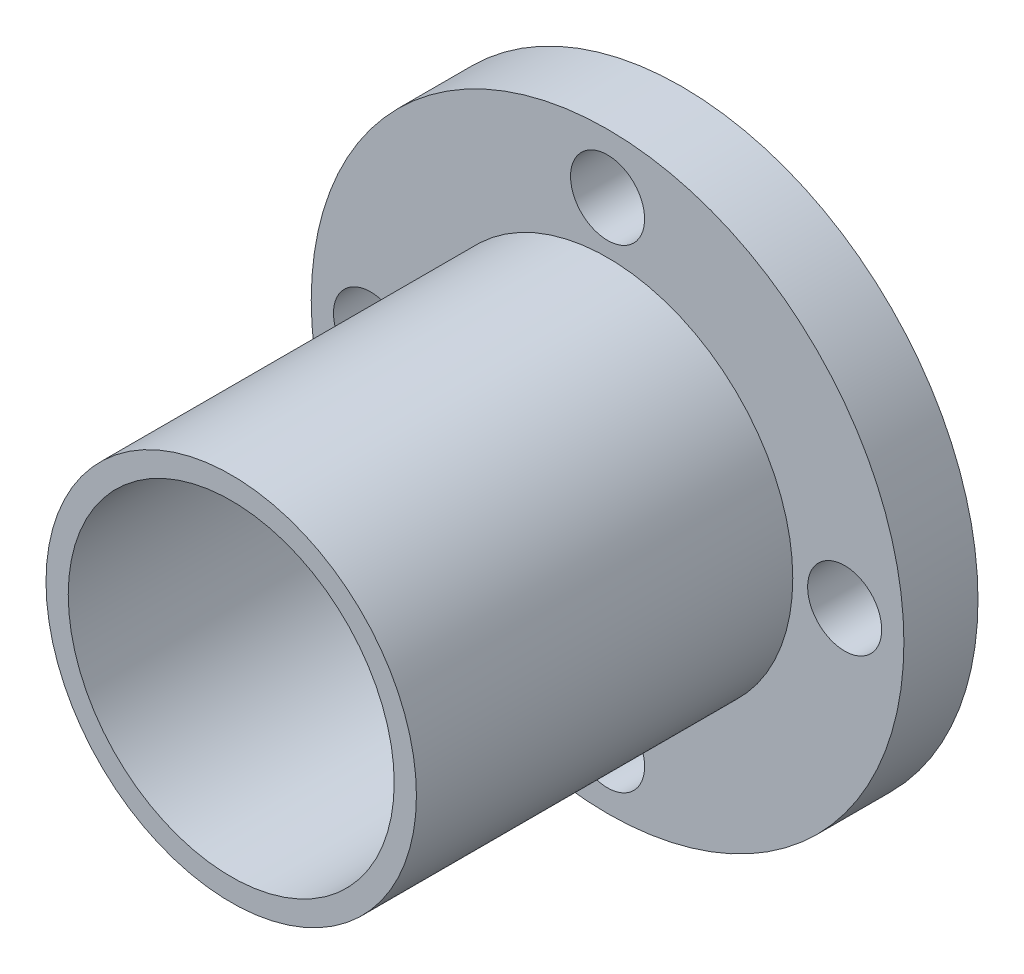
ISO-10303-21;
HEADER;
FILE_DESCRIPTION(('STEP AP214'),'2;1');
FILE_NAME('part.step','',(''),(''),'','','');
FILE_SCHEMA(('AUTOMOTIVE_DESIGN { 1 0 10303 214 1 1 1 1 }'));
ENDSEC;
DATA;
#1=APPLICATION_CONTEXT('core data for automotive mechanical design processes');
#2=APPLICATION_PROTOCOL_DEFINITION('international standard','automotive_design',2000,#1);
#3=PRODUCT_CONTEXT('',#1,'mechanical');
#4=PRODUCT('Part','Part','',(#3));
#5=PRODUCT_RELATED_PRODUCT_CATEGORY('part','',(#4));
#6=PRODUCT_DEFINITION_FORMATION('','',#4);
#7=PRODUCT_DEFINITION_CONTEXT('part definition',#1,'design');
#8=PRODUCT_DEFINITION('design','',#6,#7);
#9=PRODUCT_DEFINITION_SHAPE('','',#8);
#10=(LENGTH_UNIT() NAMED_UNIT(*) SI_UNIT(.MILLI.,.METRE.));
#11=(NAMED_UNIT(*) PLANE_ANGLE_UNIT() SI_UNIT($,.RADIAN.));
#12=(NAMED_UNIT(*) SI_UNIT($,.STERADIAN.) SOLID_ANGLE_UNIT());
#13=UNCERTAINTY_MEASURE_WITH_UNIT(LENGTH_MEASURE(1.E-05),#10,'distance_accuracy_value','');
#14=(GEOMETRIC_REPRESENTATION_CONTEXT(3) GLOBAL_UNCERTAINTY_ASSIGNED_CONTEXT((#13)) GLOBAL_UNIT_ASSIGNED_CONTEXT((#10,
#11,#12)) REPRESENTATION_CONTEXT('',''));
#15=CARTESIAN_POINT('',(0.,0.,0.));
#16=DIRECTION('',(0.,0.,1.));
#17=DIRECTION('',(1.,0.,0.));
#18=AXIS2_PLACEMENT_3D('',#15,#16,#17);
#19=CARTESIAN_POINT('',(0.,0.,10.));
#20=DIRECTION('',(0.,0.,1.));
#21=DIRECTION('',(1.,0.,0.));
#22=AXIS2_PLACEMENT_3D('',#19,#20,#21);
#23=PLANE('',#22);
#24=CARTESIAN_POINT('',(0.,0.,10.));
#25=DIRECTION('',(0.,0.,1.));
#26=DIRECTION('',(1.,0.,0.));
#27=AXIS2_PLACEMENT_3D('',#24,#25,#26);
#28=CIRCLE('',#27,25.);
#29=CARTESIAN_POINT('',(25.,0.,10.));
#30=VERTEX_POINT('',#29);
#31=EDGE_CURVE('E96',#30,#30,#28,.T.);
#32=ORIENTED_EDGE('',*,*,#31,.F.);
#33=EDGE_LOOP('',(#32));
#34=FACE_BOUND('',#33,.T.);
#35=CARTESIAN_POINT('',(-32.,0.,10.));
#36=DIRECTION('',(0.,0.,1.));
#37=DIRECTION('',(1.,0.,0.));
#38=AXIS2_PLACEMENT_3D('',#35,#36,#37);
#39=CIRCLE('',#38,5.);
#40=CARTESIAN_POINT('',(-27.,0.,10.));
#41=VERTEX_POINT('',#40);
#42=EDGE_CURVE('E76',#41,#41,#39,.T.);
#43=ORIENTED_EDGE('',*,*,#42,.F.);
#44=EDGE_LOOP('',(#43));
#45=FACE_BOUND('',#44,.T.);
#46=CARTESIAN_POINT('',(0.,-32.,10.));
#47=DIRECTION('',(0.,0.,1.));
#48=DIRECTION('',(1.,0.,0.));
#49=AXIS2_PLACEMENT_3D('',#46,#47,#48);
#50=CIRCLE('',#49,5.);
#51=CARTESIAN_POINT('',(5.,-32.,10.));
#52=VERTEX_POINT('',#51);
#53=EDGE_CURVE('E62',#52,#52,#50,.T.);
#54=ORIENTED_EDGE('',*,*,#53,.F.);
#55=EDGE_LOOP('',(#54));
#56=FACE_BOUND('',#55,.T.);
#57=CARTESIAN_POINT('',(0.,0.,10.));
#58=DIRECTION('',(0.,0.,1.));
#59=DIRECTION('',(1.,0.,0.));
#60=AXIS2_PLACEMENT_3D('',#57,#58,#59);
#61=CIRCLE('',#60,40.);
#62=CARTESIAN_POINT('',(40.,0.,10.));
#63=VERTEX_POINT('',#62);
#64=EDGE_CURVE('E52',#63,#63,#61,.T.);
#65=ORIENTED_EDGE('',*,*,#64,.T.);
#66=EDGE_LOOP('',(#65));
#67=FACE_BOUND('',#66,.T.);
#68=CARTESIAN_POINT('',(0.,32.,10.));
#69=DIRECTION('',(0.,0.,1.));
#70=DIRECTION('',(-1.,0.,0.));
#71=AXIS2_PLACEMENT_3D('',#68,#69,#70);
#72=CIRCLE('',#71,5.);
#73=CARTESIAN_POINT('',(-5.,32.,10.));
#74=VERTEX_POINT('',#73);
#75=EDGE_CURVE('E68',#74,#74,#72,.T.);
#76=ORIENTED_EDGE('',*,*,#75,.F.);
#77=EDGE_LOOP('',(#76));
#78=FACE_BOUND('',#77,.T.);
#79=CARTESIAN_POINT('',(32.,0.,10.));
#80=DIRECTION('',(0.,0.,1.));
#81=DIRECTION('',(-1.,0.,0.));
#82=AXIS2_PLACEMENT_3D('',#79,#80,#81);
#83=CIRCLE('',#82,5.);
#84=CARTESIAN_POINT('',(27.,0.,10.));
#85=VERTEX_POINT('',#84);
#86=EDGE_CURVE('E84',#85,#85,#83,.T.);
#87=ORIENTED_EDGE('',*,*,#86,.F.);
#88=EDGE_LOOP('',(#87));
#89=FACE_BOUND('',#88,.T.);
#90=ADVANCED_FACE('F43',(#34,#45,#56,#67,#78,#89),#23,.T.);
#91=CARTESIAN_POINT('',(0.,0.,0.));
#92=DIRECTION('',(0.,0.,1.));
#93=DIRECTION('',(1.,0.,0.));
#94=AXIS2_PLACEMENT_3D('',#91,#92,#93);
#95=PLANE('',#94);
#96=CARTESIAN_POINT('',(0.,0.,0.));
#97=DIRECTION('',(0.,0.,-1.));
#98=DIRECTION('',(-1.,0.,0.));
#99=AXIS2_PLACEMENT_3D('',#96,#97,#98);
#100=CIRCLE('',#99,10.);
#101=CARTESIAN_POINT('',(-10.,0.,0.));
#102=VERTEX_POINT('',#101);
#103=EDGE_CURVE('E107',#102,#102,#100,.T.);
#104=ORIENTED_EDGE('',*,*,#103,.F.);
#105=EDGE_LOOP('',(#104));
#106=FACE_BOUND('',#105,.T.);
#107=CARTESIAN_POINT('',(0.,0.,0.));
#108=DIRECTION('',(0.,0.,1.));
#109=DIRECTION('',(1.,0.,0.));
#110=AXIS2_PLACEMENT_3D('',#107,#108,#109);
#111=CIRCLE('',#110,40.);
#112=CARTESIAN_POINT('',(40.,0.,0.));
#113=VERTEX_POINT('',#112);
#114=EDGE_CURVE('E57',#113,#113,#111,.T.);
#115=ORIENTED_EDGE('',*,*,#114,.F.);
#116=EDGE_LOOP('',(#115));
#117=FACE_BOUND('',#116,.T.);
#118=CARTESIAN_POINT('',(0.,-32.,0.));
#119=DIRECTION('',(0.,0.,1.));
#120=DIRECTION('',(1.,0.,0.));
#121=AXIS2_PLACEMENT_3D('',#118,#119,#120);
#122=CIRCLE('',#121,5.);
#123=CARTESIAN_POINT('',(5.,-32.,0.));
#124=VERTEX_POINT('',#123);
#125=EDGE_CURVE('E64',#124,#124,#122,.T.);
#126=ORIENTED_EDGE('',*,*,#125,.T.);
#127=EDGE_LOOP('',(#126));
#128=FACE_BOUND('',#127,.T.);
#129=CARTESIAN_POINT('',(0.,32.,0.));
#130=DIRECTION('',(0.,0.,1.));
#131=DIRECTION('',(-1.,0.,0.));
#132=AXIS2_PLACEMENT_3D('',#129,#130,#131);
#133=CIRCLE('',#132,5.);
#134=CARTESIAN_POINT('',(-5.,32.,0.));
#135=VERTEX_POINT('',#134);
#136=EDGE_CURVE('E72',#135,#135,#133,.T.);
#137=ORIENTED_EDGE('',*,*,#136,.T.);
#138=EDGE_LOOP('',(#137));
#139=FACE_BOUND('',#138,.T.);
#140=CARTESIAN_POINT('',(-32.,0.,0.));
#141=DIRECTION('',(0.,0.,1.));
#142=DIRECTION('',(1.,0.,0.));
#143=AXIS2_PLACEMENT_3D('',#140,#141,#142);
#144=CIRCLE('',#143,5.);
#145=CARTESIAN_POINT('',(-27.,0.,0.));
#146=VERTEX_POINT('',#145);
#147=EDGE_CURVE('E80',#146,#146,#144,.T.);
#148=ORIENTED_EDGE('',*,*,#147,.T.);
#149=EDGE_LOOP('',(#148));
#150=FACE_BOUND('',#149,.T.);
#151=CARTESIAN_POINT('',(32.,0.,0.));
#152=DIRECTION('',(0.,0.,1.));
#153=DIRECTION('',(-1.,0.,0.));
#154=AXIS2_PLACEMENT_3D('',#151,#152,#153);
#155=CIRCLE('',#154,5.);
#156=CARTESIAN_POINT('',(27.,0.,0.));
#157=VERTEX_POINT('',#156);
#158=EDGE_CURVE('E88',#157,#157,#155,.T.);
#159=ORIENTED_EDGE('',*,*,#158,.T.);
#160=EDGE_LOOP('',(#159));
#161=FACE_BOUND('',#160,.T.);
#162=ADVANCED_FACE('F134',(#106,#117,#128,#139,#150,#161),#95,.F.);
#163=CARTESIAN_POINT('',(0.,0.,10.));
#164=DIRECTION('',(0.,0.,-1.));
#165=DIRECTION('',(-1.,0.,0.));
#166=AXIS2_PLACEMENT_3D('',#163,#164,#165);
#167=CYLINDRICAL_SURFACE('',#166,40.);
#168=ORIENTED_EDGE('',*,*,#64,.F.);
#169=EDGE_LOOP('',(#168));
#170=FACE_BOUND('',#169,.T.);
#171=ORIENTED_EDGE('',*,*,#114,.T.);
#172=EDGE_LOOP('',(#171));
#173=FACE_BOUND('',#172,.T.);
#174=ADVANCED_FACE('F45',(#170,#173),#167,.T.);
#175=CARTESIAN_POINT('',(0.,-32.,10.));
#176=DIRECTION('',(0.,0.,-1.));
#177=DIRECTION('',(-1.,0.,0.));
#178=AXIS2_PLACEMENT_3D('',#175,#176,#177);
#179=CYLINDRICAL_SURFACE('',#178,5.);
#180=ORIENTED_EDGE('',*,*,#53,.T.);
#181=EDGE_LOOP('',(#180));
#182=FACE_BOUND('',#181,.T.);
#183=ORIENTED_EDGE('',*,*,#125,.F.);
#184=EDGE_LOOP('',(#183));
#185=FACE_BOUND('',#184,.T.);
#186=ADVANCED_FACE('F171',(#182,#185),#179,.F.);
#187=CARTESIAN_POINT('',(0.,32.,10.));
#188=DIRECTION('',(0.,0.,-1.));
#189=DIRECTION('',(-1.,0.,0.));
#190=AXIS2_PLACEMENT_3D('',#187,#188,#189);
#191=CYLINDRICAL_SURFACE('',#190,5.);
#192=ORIENTED_EDGE('',*,*,#75,.T.);
#193=EDGE_LOOP('',(#192));
#194=FACE_BOUND('',#193,.T.);
#195=ORIENTED_EDGE('',*,*,#136,.F.);
#196=EDGE_LOOP('',(#195));
#197=FACE_BOUND('',#196,.T.);
#198=ADVANCED_FACE('F165',(#194,#197),#191,.F.);
#199=CARTESIAN_POINT('',(-32.,0.,10.));
#200=DIRECTION('',(0.,0.,-1.));
#201=DIRECTION('',(-1.,0.,0.));
#202=AXIS2_PLACEMENT_3D('',#199,#200,#201);
#203=CYLINDRICAL_SURFACE('',#202,5.);
#204=ORIENTED_EDGE('',*,*,#42,.T.);
#205=EDGE_LOOP('',(#204));
#206=FACE_BOUND('',#205,.T.);
#207=ORIENTED_EDGE('',*,*,#147,.F.);
#208=EDGE_LOOP('',(#207));
#209=FACE_BOUND('',#208,.T.);
#210=ADVANCED_FACE('F156',(#206,#209),#203,.F.);
#211=CARTESIAN_POINT('',(32.,0.,10.));
#212=DIRECTION('',(0.,0.,-1.));
#213=DIRECTION('',(-1.,0.,0.));
#214=AXIS2_PLACEMENT_3D('',#211,#212,#213);
#215=CYLINDRICAL_SURFACE('',#214,5.);
#216=ORIENTED_EDGE('',*,*,#86,.T.);
#217=EDGE_LOOP('',(#216));
#218=FACE_BOUND('',#217,.T.);
#219=ORIENTED_EDGE('',*,*,#158,.F.);
#220=EDGE_LOOP('',(#219));
#221=FACE_BOUND('',#220,.T.);
#222=ADVANCED_FACE('F153',(#218,#221),#215,.F.);
#223=CARTESIAN_POINT('',(0.,0.,60.8));
#224=DIRECTION('',(0.,0.,1.));
#225=DIRECTION('',(1.,0.,0.));
#226=AXIS2_PLACEMENT_3D('',#223,#224,#225);
#227=PLANE('',#226);
#228=CARTESIAN_POINT('',(0.,0.,60.8));
#229=DIRECTION('',(0.,0.,1.));
#230=DIRECTION('',(1.,0.,0.));
#231=AXIS2_PLACEMENT_3D('',#228,#229,#230);
#232=CIRCLE('',#231,25.);
#233=CARTESIAN_POINT('',(25.,0.,60.8));
#234=VERTEX_POINT('',#233);
#235=EDGE_CURVE('E92',#234,#234,#232,.T.);
#236=ORIENTED_EDGE('',*,*,#235,.T.);
#237=EDGE_LOOP('',(#236));
#238=FACE_BOUND('',#237,.T.);
#239=CARTESIAN_POINT('',(0.,0.,60.8));
#240=DIRECTION('',(0.,0.,1.));
#241=DIRECTION('',(1.,0.,0.));
#242=AXIS2_PLACEMENT_3D('',#239,#240,#241);
#243=CIRCLE('',#242,22.);
#244=CARTESIAN_POINT('',(22.,0.,60.8));
#245=VERTEX_POINT('',#244);
#246=EDGE_CURVE('E100',#245,#245,#243,.T.);
#247=ORIENTED_EDGE('',*,*,#246,.F.);
#248=EDGE_LOOP('',(#247));
#249=FACE_BOUND('',#248,.T.);
#250=ADVANCED_FACE('F155',(#238,#249),#227,.T.);
#251=CARTESIAN_POINT('',(0.,0.,60.8));
#252=DIRECTION('',(0.,0.,-1.));
#253=DIRECTION('',(-1.,0.,0.));
#254=AXIS2_PLACEMENT_3D('',#251,#252,#253);
#255=CYLINDRICAL_SURFACE('',#254,25.);
#256=ORIENTED_EDGE('',*,*,#235,.F.);
#257=EDGE_LOOP('',(#256));
#258=FACE_BOUND('',#257,.T.);
#259=ORIENTED_EDGE('',*,*,#31,.T.);
#260=EDGE_LOOP('',(#259));
#261=FACE_BOUND('',#260,.T.);
#262=ADVANCED_FACE('F129',(#258,#261),#255,.T.);
#263=CARTESIAN_POINT('',(0.,0.,60.8));
#264=DIRECTION('',(0.,0.,-1.));
#265=DIRECTION('',(-1.,0.,0.));
#266=AXIS2_PLACEMENT_3D('',#263,#264,#265);
#267=CYLINDRICAL_SURFACE('',#266,22.);
#268=ORIENTED_EDGE('',*,*,#246,.T.);
#269=EDGE_LOOP('',(#268));
#270=FACE_BOUND('',#269,.T.);
#271=CARTESIAN_POINT('',(0.,0.,10.));
#272=DIRECTION('',(0.,0.,1.));
#273=DIRECTION('',(1.,0.,0.));
#274=AXIS2_PLACEMENT_3D('',#271,#272,#273);
#275=CIRCLE('',#274,22.);
#276=CARTESIAN_POINT('',(22.,0.,10.));
#277=VERTEX_POINT('',#276);
#278=EDGE_CURVE('E10',#277,#277,#275,.F.);
#279=ORIENTED_EDGE('',*,*,#278,.T.);
#280=EDGE_LOOP('',(#279));
#281=FACE_BOUND('',#280,.T.);
#282=ADVANCED_FACE('F121',(#270,#281),#267,.F.);
#283=CARTESIAN_POINT('',(0.,0.,9.99999999999999));
#284=DIRECTION('',(0.,0.,1.));
#285=DIRECTION('',(1.,0.,0.));
#286=AXIS2_PLACEMENT_3D('',#283,#284,#285);
#287=CIRCLE('',#286,10.);
#288=CARTESIAN_POINT('',(10.,0.,9.99999999999999));
#289=VERTEX_POINT('',#288);
#290=EDGE_CURVE('E47',#289,#289,#287,.T.);
#291=ORIENTED_EDGE('',*,*,#290,.F.);
#292=EDGE_LOOP('',(#291));
#293=FACE_BOUND('',#292,.T.);
#294=ORIENTED_EDGE('',*,*,#278,.F.);
#295=EDGE_LOOP('',(#294));
#296=FACE_BOUND('',#295,.T.);
#297=ADVANCED_FACE('F118',(#293,#296),#23,.T.);
#298=CARTESIAN_POINT('',(0.,0.,100.));
#299=DIRECTION('',(0.,0.,-1.));
#300=DIRECTION('',(-1.,0.,0.));
#301=AXIS2_PLACEMENT_3D('',#298,#299,#300);
#302=CYLINDRICAL_SURFACE('',#301,10.);
#303=ORIENTED_EDGE('',*,*,#290,.T.);
#304=EDGE_LOOP('',(#303));
#305=FACE_BOUND('',#304,.T.);
#306=ORIENTED_EDGE('',*,*,#103,.T.);
#307=EDGE_LOOP('',(#306));
#308=FACE_BOUND('',#307,.T.);
#309=ADVANCED_FACE('F116',(#305,#308),#302,.F.);
#310=CLOSED_SHELL('',(#90,#162,#174,#186,#198,#210,#222,#250,#262,#282,#297,#309));
#311=MANIFOLD_SOLID_BREP('B2',#310);
#312=ADVANCED_BREP_SHAPE_REPRESENTATION('',(#18,#311),#14);
#313=SHAPE_DEFINITION_REPRESENTATION(#9,#312);
ENDSEC;
END-ISO-10303-21;
